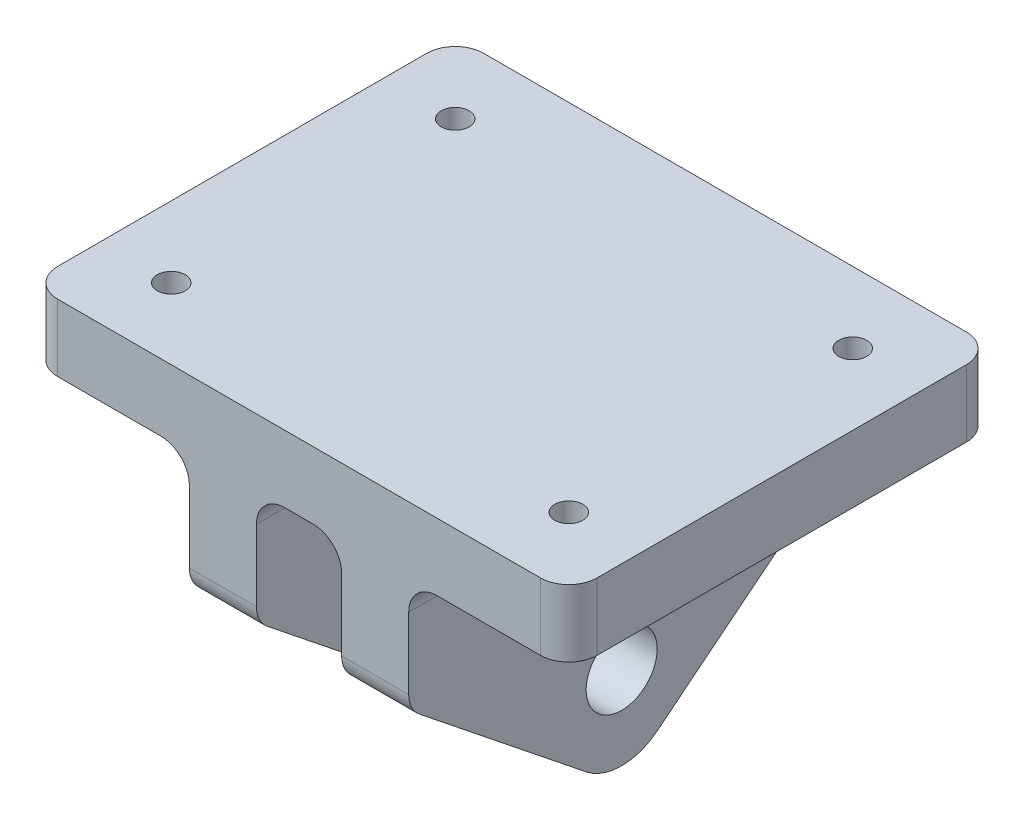
ISO-10303-21;
HEADER;
FILE_DESCRIPTION(('STEP AP214'),'2;1');
FILE_NAME('part.step','',(''),(''),'','','');
FILE_SCHEMA(('AUTOMOTIVE_DESIGN { 1 0 10303 214 1 1 1 1 }'));
ENDSEC;
DATA;
#1=APPLICATION_CONTEXT('core data for automotive mechanical design processes');
#2=APPLICATION_PROTOCOL_DEFINITION('international standard','automotive_design',2000,#1);
#3=PRODUCT_CONTEXT('',#1,'mechanical');
#4=PRODUCT('Part','Part','',(#3));
#5=PRODUCT_RELATED_PRODUCT_CATEGORY('part','',(#4));
#6=PRODUCT_DEFINITION_FORMATION('','',#4);
#7=PRODUCT_DEFINITION_CONTEXT('part definition',#1,'design');
#8=PRODUCT_DEFINITION('design','',#6,#7);
#9=PRODUCT_DEFINITION_SHAPE('','',#8);
#10=(LENGTH_UNIT() NAMED_UNIT(*) SI_UNIT(.MILLI.,.METRE.));
#11=(NAMED_UNIT(*) PLANE_ANGLE_UNIT() SI_UNIT($,.RADIAN.));
#12=(NAMED_UNIT(*) SI_UNIT($,.STERADIAN.) SOLID_ANGLE_UNIT());
#13=UNCERTAINTY_MEASURE_WITH_UNIT(LENGTH_MEASURE(1.E-05),#10,'distance_accuracy_value','');
#14=(GEOMETRIC_REPRESENTATION_CONTEXT(3) GLOBAL_UNCERTAINTY_ASSIGNED_CONTEXT((#13)) GLOBAL_UNIT_ASSIGNED_CONTEXT((#10,
#11,#12)) REPRESENTATION_CONTEXT('',''));
#15=CARTESIAN_POINT('',(0.,0.,0.));
#16=DIRECTION('',(0.,0.,1.));
#17=DIRECTION('',(1.,0.,0.));
#18=AXIS2_PLACEMENT_3D('',#15,#16,#17);
#19=CARTESIAN_POINT('',(0.,0.,0.));
#20=DIRECTION('',(0.,-1.,0.));
#21=DIRECTION('',(0.,0.,-1.));
#22=AXIS2_PLACEMENT_3D('',#19,#20,#21);
#23=PLANE('',#22);
#24=DIRECTION('',(1.,0.,0.));
#25=VECTOR('',#24,1.);
#26=CARTESIAN_POINT('',(0.,0.,19.05));
#27=LINE('',#26,#25);
#28=CARTESIAN_POINT('',(-1.27,0.,19.05));
#29=VERTEX_POINT('',#28);
#30=CARTESIAN_POINT('',(1.27,0.,19.05));
#31=VERTEX_POINT('',#30);
#32=EDGE_CURVE('E407',#29,#31,#27,.T.);
#33=ORIENTED_EDGE('',*,*,#32,.F.);
#34=DIRECTION('',(0.,0.,-1.));
#35=VECTOR('',#34,1.);
#36=CARTESIAN_POINT('',(-1.27,0.,0.));
#37=LINE('',#36,#35);
#38=CARTESIAN_POINT('',(-1.27,0.,-19.05));
#39=VERTEX_POINT('',#38);
#40=EDGE_CURVE('E333',#29,#39,#37,.T.);
#41=ORIENTED_EDGE('',*,*,#40,.T.);
#42=DIRECTION('',(1.,0.,0.));
#43=VECTOR('',#42,1.);
#44=CARTESIAN_POINT('',(0.,0.,-19.05));
#45=LINE('',#44,#43);
#46=CARTESIAN_POINT('',(1.27,0.,-19.05));
#47=VERTEX_POINT('',#46);
#48=EDGE_CURVE('E474',#39,#47,#45,.T.);
#49=ORIENTED_EDGE('',*,*,#48,.T.);
#50=DIRECTION('',(0.,0.,-1.));
#51=VECTOR('',#50,1.);
#52=CARTESIAN_POINT('',(1.27,0.,0.));
#53=LINE('',#52,#51);
#54=EDGE_CURVE('E331',#47,#31,#53,.F.);
#55=ORIENTED_EDGE('',*,*,#54,.T.);
#56=EDGE_LOOP('',(#33,#41,#49,#55));
#57=FACE_BOUND('',#56,.T.);
#58=ADVANCED_FACE('F46',(#57),#23,.T.);
#59=CARTESIAN_POINT('',(9.81,-15.4878048780488,-12.390243902439));
#60=DIRECTION('',(0.,0.78086880944303,0.624695047554424));
#61=DIRECTION('',(0.,-0.624695047554424,0.78086880944303));
#62=AXIS2_PLACEMENT_3D('',#59,#60,#61);
#63=PLANE('',#62);
#64=DIRECTION('',(0.,0.624695047554424,-0.78086880944303));
#65=VECTOR('',#64,1.);
#66=CARTESIAN_POINT('',(9.81,-15.4878048780488,-12.390243902439));
#67=LINE('',#66,#65);
#68=CARTESIAN_POINT('',(9.81,-22.8612393267388,-3.17345084157647));
#69=VERTEX_POINT('',#68);
#70=CARTESIAN_POINT('',(9.81,-10.9226196633694,-18.0967254207882));
#71=VERTEX_POINT('',#70);
#72=EDGE_CURVE('E394',#69,#71,#67,.T.);
#73=ORIENTED_EDGE('',*,*,#72,.F.);
#74=DIRECTION('',(-1.,0.,0.));
#75=VECTOR('',#74,1.);
#76=CARTESIAN_POINT('',(9.81,-22.8612393267388,-3.17345084157647));
#77=LINE('',#76,#75);
#78=CARTESIAN_POINT('',(3.81,-22.8612393267388,-3.17345084157647));
#79=VERTEX_POINT('',#78);
#80=EDGE_CURVE('E287',#69,#79,#77,.T.);
#81=ORIENTED_EDGE('',*,*,#80,.T.);
#82=DIRECTION('',(0.,0.624695047554424,-0.78086880944303));
#83=VECTOR('',#82,1.);
#84=CARTESIAN_POINT('',(3.81,-15.4878048780488,-12.390243902439));
#85=LINE('',#84,#83);
#86=CARTESIAN_POINT('',(3.81,-10.9226196633694,-18.0967254207882));
#87=VERTEX_POINT('',#86);
#88=EDGE_CURVE('E421',#79,#87,#85,.T.);
#89=ORIENTED_EDGE('',*,*,#88,.T.);
#90=DIRECTION('',(-1.,0.,0.));
#91=VECTOR('',#90,1.);
#92=CARTESIAN_POINT('',(9.81,-10.9226196633694,-18.0967254207882));
#93=LINE('',#92,#91);
#94=EDGE_CURVE('E285',#87,#71,#93,.F.);
#95=ORIENTED_EDGE('',*,*,#94,.T.);
#96=EDGE_LOOP('',(#73,#81,#89,#95));
#97=FACE_BOUND('',#96,.T.);
#98=ADVANCED_FACE('F462',(#97),#63,.F.);
#99=CARTESIAN_POINT('',(9.81,0.,-19.05));
#100=DIRECTION('',(0.,0.,1.));
#101=DIRECTION('',(0.,-1.,0.));
#102=AXIS2_PLACEMENT_3D('',#99,#100,#101);
#103=PLANE('',#102);
#104=DIRECTION('',(0.,1.,0.));
#105=VECTOR('',#104,1.);
#106=CARTESIAN_POINT('',(-3.81,0.,-19.05));
#107=LINE('',#106,#105);
#108=CARTESIAN_POINT('',(-3.81,-8.93921288738412,-19.05));
#109=VERTEX_POINT('',#108);
#110=CARTESIAN_POINT('',(-3.81,-2.53999999999999,-19.05));
#111=VERTEX_POINT('',#110);
#112=EDGE_CURVE('E517',#109,#111,#107,.T.);
#113=ORIENTED_EDGE('',*,*,#112,.F.);
#114=DIRECTION('',(1.,0.,0.));
#115=VECTOR('',#114,1.);
#116=CARTESIAN_POINT('',(-9.81,-8.93921288738412,-19.05));
#117=LINE('',#116,#115);
#118=CARTESIAN_POINT('',(-9.81,-8.93921288738412,-19.05));
#119=VERTEX_POINT('',#118);
#120=EDGE_CURVE('E320',#109,#119,#117,.F.);
#121=ORIENTED_EDGE('',*,*,#120,.T.);
#122=DIRECTION('',(0.,1.,0.));
#123=VECTOR('',#122,1.);
#124=CARTESIAN_POINT('',(-9.81,0.,-19.05));
#125=LINE('',#124,#123);
#126=CARTESIAN_POINT('',(-9.81,-2.53999999999999,-19.05));
#127=VERTEX_POINT('',#126);
#128=EDGE_CURVE('E514',#119,#127,#125,.T.);
#129=ORIENTED_EDGE('',*,*,#128,.T.);
#130=CARTESIAN_POINT('',(-12.35,-2.53999999999999,-19.05));
#131=DIRECTION('',(0.,0.,1.));
#132=DIRECTION('',(0.,-1.,0.));
#133=AXIS2_PLACEMENT_3D('',#130,#131,#132);
#134=CIRCLE('',#133,2.54);
#135=CARTESIAN_POINT('',(-12.35,0.,-19.05));
#136=VERTEX_POINT('',#135);
#137=EDGE_CURVE('E373',#127,#136,#134,.T.);
#138=ORIENTED_EDGE('',*,*,#137,.T.);
#139=CARTESIAN_POINT('',(-21.59,0.,-19.05));
#140=VERTEX_POINT('',#139);
#141=EDGE_CURVE('E478',#140,#136,#45,.T.);
#142=ORIENTED_EDGE('',*,*,#141,.F.);
#143=DIRECTION('',(0.,1.,0.));
#144=VECTOR('',#143,1.);
#145=CARTESIAN_POINT('',(-21.59,5.999999938,-19.05));
#146=LINE('',#145,#144);
#147=CARTESIAN_POINT('',(-21.59,5.999999938,-19.05));
#148=VERTEX_POINT('',#147);
#149=EDGE_CURVE('E314',#140,#148,#146,.T.);
#150=ORIENTED_EDGE('',*,*,#149,.T.);
#151=DIRECTION('',(1.,0.,0.));
#152=VECTOR('',#151,1.);
#153=CARTESIAN_POINT('',(0.,5.999999938,-19.05));
#154=LINE('',#153,#152);
#155=CARTESIAN_POINT('',(21.59,5.999999938,-19.05));
#156=VERTEX_POINT('',#155);
#157=EDGE_CURVE('E413',#148,#156,#154,.T.);
#158=ORIENTED_EDGE('',*,*,#157,.T.);
#159=DIRECTION('',(0.,1.,0.));
#160=VECTOR('',#159,1.);
#161=CARTESIAN_POINT('',(21.59,0.,-19.05));
#162=LINE('',#161,#160);
#163=CARTESIAN_POINT('',(21.59,0.,-19.05));
#164=VERTEX_POINT('',#163);
#165=EDGE_CURVE('E312',#156,#164,#162,.F.);
#166=ORIENTED_EDGE('',*,*,#165,.T.);
#167=CARTESIAN_POINT('',(12.35,0.,-19.05));
#168=VERTEX_POINT('',#167);
#169=EDGE_CURVE('E384',#168,#164,#45,.T.);
#170=ORIENTED_EDGE('',*,*,#169,.F.);
#171=CARTESIAN_POINT('',(12.35,-2.53999999999999,-19.05));
#172=DIRECTION('',(0.,0.,1.));
#173=DIRECTION('',(0.,-1.,0.));
#174=AXIS2_PLACEMENT_3D('',#171,#172,#173);
#175=CIRCLE('',#174,2.54);
#176=CARTESIAN_POINT('',(9.81,-2.53999999999999,-19.05));
#177=VERTEX_POINT('',#176);
#178=EDGE_CURVE('E54',#168,#177,#175,.T.);
#179=ORIENTED_EDGE('',*,*,#178,.T.);
#180=DIRECTION('',(0.,1.,0.));
#181=VECTOR('',#180,1.);
#182=CARTESIAN_POINT('',(9.81,0.,-19.05));
#183=LINE('',#182,#181);
#184=CARTESIAN_POINT('',(9.81,-8.93921288738411,-19.05));
#185=VERTEX_POINT('',#184);
#186=EDGE_CURVE('E382',#185,#177,#183,.T.);
#187=ORIENTED_EDGE('',*,*,#186,.F.);
#188=DIRECTION('',(-1.,0.,0.));
#189=VECTOR('',#188,1.);
#190=CARTESIAN_POINT('',(9.81,-8.93921288738411,-19.05));
#191=LINE('',#190,#189);
#192=CARTESIAN_POINT('',(3.81,-8.93921288738411,-19.05));
#193=VERTEX_POINT('',#192);
#194=EDGE_CURVE('E317',#185,#193,#191,.T.);
#195=ORIENTED_EDGE('',*,*,#194,.T.);
#196=DIRECTION('',(0.,1.,0.));
#197=VECTOR('',#196,1.);
#198=CARTESIAN_POINT('',(3.81,0.,-19.05));
#199=LINE('',#198,#197);
#200=CARTESIAN_POINT('',(3.81,-2.53999999999999,-19.05));
#201=VERTEX_POINT('',#200);
#202=EDGE_CURVE('E426',#193,#201,#199,.T.);
#203=ORIENTED_EDGE('',*,*,#202,.T.);
#204=CARTESIAN_POINT('',(1.27,-2.53999999999999,-19.05));
#205=DIRECTION('',(0.,0.,1.));
#206=DIRECTION('',(0.,-1.,0.));
#207=AXIS2_PLACEMENT_3D('',#204,#205,#206);
#208=CIRCLE('',#207,2.54);
#209=EDGE_CURVE('E369',#201,#47,#208,.T.);
#210=ORIENTED_EDGE('',*,*,#209,.T.);
#211=ORIENTED_EDGE('',*,*,#48,.F.);
#212=CARTESIAN_POINT('',(-1.27,-2.53999999999999,-19.05));
#213=DIRECTION('',(0.,0.,1.));
#214=DIRECTION('',(0.,-1.,0.));
#215=AXIS2_PLACEMENT_3D('',#212,#213,#214);
#216=CIRCLE('',#215,2.54);
#217=EDGE_CURVE('E365',#39,#111,#216,.T.);
#218=ORIENTED_EDGE('',*,*,#217,.T.);
#219=EDGE_LOOP('',(#113,#121,#129,#138,#142,#150,#158,#166,#170,#179,#187,#195,#203,#210,#211,#218));
#220=FACE_BOUND('',#219,.T.);
#221=ADVANCED_FACE('F381',(#220),#103,.F.);
#222=CARTESIAN_POINT('',(9.81,0.,19.05));
#223=DIRECTION('',(0.,0.,-1.));
#224=DIRECTION('',(0.,1.,0.));
#225=AXIS2_PLACEMENT_3D('',#222,#223,#224);
#226=PLANE('',#225);
#227=DIRECTION('',(0.,-1.,0.));
#228=VECTOR('',#227,1.);
#229=CARTESIAN_POINT('',(-9.81,0.,19.05));
#230=LINE('',#229,#228);
#231=CARTESIAN_POINT('',(-9.81,-2.54,19.05));
#232=VERTEX_POINT('',#231);
#233=CARTESIAN_POINT('',(-9.81,-8.93921288738411,19.05));
#234=VERTEX_POINT('',#233);
#235=EDGE_CURVE('E529',#232,#234,#230,.T.);
#236=ORIENTED_EDGE('',*,*,#235,.T.);
#237=DIRECTION('',(1.,0.,0.));
#238=VECTOR('',#237,1.);
#239=CARTESIAN_POINT('',(-3.81,-8.93921288738411,19.05));
#240=LINE('',#239,#238);
#241=CARTESIAN_POINT('',(-3.81,-8.93921288738411,19.05));
#242=VERTEX_POINT('',#241);
#243=EDGE_CURVE('E329',#234,#242,#240,.T.);
#244=ORIENTED_EDGE('',*,*,#243,.T.);
#245=DIRECTION('',(0.,-1.,0.));
#246=VECTOR('',#245,1.);
#247=CARTESIAN_POINT('',(-3.81,0.,19.05));
#248=LINE('',#247,#246);
#249=CARTESIAN_POINT('',(-3.81,-2.54,19.05));
#250=VERTEX_POINT('',#249);
#251=EDGE_CURVE('E237',#250,#242,#248,.T.);
#252=ORIENTED_EDGE('',*,*,#251,.F.);
#253=CARTESIAN_POINT('',(-1.27,-2.54,19.05));
#254=DIRECTION('',(0.,0.,-1.));
#255=DIRECTION('',(0.,1.,0.));
#256=AXIS2_PLACEMENT_3D('',#253,#254,#255);
#257=CIRCLE('',#256,2.54);
#258=EDGE_CURVE('E367',#250,#29,#257,.T.);
#259=ORIENTED_EDGE('',*,*,#258,.T.);
#260=ORIENTED_EDGE('',*,*,#32,.T.);
#261=CARTESIAN_POINT('',(1.27,-2.54,19.05));
#262=DIRECTION('',(0.,0.,-1.));
#263=DIRECTION('',(0.,1.,0.));
#264=AXIS2_PLACEMENT_3D('',#261,#262,#263);
#265=CIRCLE('',#264,2.54);
#266=CARTESIAN_POINT('',(3.81,-2.54,19.05));
#267=VERTEX_POINT('',#266);
#268=EDGE_CURVE('E371',#31,#267,#265,.T.);
#269=ORIENTED_EDGE('',*,*,#268,.T.);
#270=DIRECTION('',(0.,-1.,0.));
#271=VECTOR('',#270,1.);
#272=CARTESIAN_POINT('',(3.81,0.,19.05));
#273=LINE('',#272,#271);
#274=CARTESIAN_POINT('',(3.81,-8.93921288738411,19.05));
#275=VERTEX_POINT('',#274);
#276=EDGE_CURVE('E431',#267,#275,#273,.T.);
#277=ORIENTED_EDGE('',*,*,#276,.T.);
#278=DIRECTION('',(-1.,0.,0.));
#279=VECTOR('',#278,1.);
#280=CARTESIAN_POINT('',(9.81,-8.93921288738411,19.05));
#281=LINE('',#280,#279);
#282=CARTESIAN_POINT('',(9.81,-8.93921288738411,19.05));
#283=VERTEX_POINT('',#282);
#284=EDGE_CURVE('E327',#275,#283,#281,.F.);
#285=ORIENTED_EDGE('',*,*,#284,.T.);
#286=DIRECTION('',(0.,-1.,0.));
#287=VECTOR('',#286,1.);
#288=CARTESIAN_POINT('',(9.81,0.,19.05));
#289=LINE('',#288,#287);
#290=CARTESIAN_POINT('',(9.81,-2.54,19.05));
#291=VERTEX_POINT('',#290);
#292=EDGE_CURVE('E262',#291,#283,#289,.T.);
#293=ORIENTED_EDGE('',*,*,#292,.F.);
#294=CARTESIAN_POINT('',(12.35,-2.54,19.05));
#295=DIRECTION('',(0.,0.,-1.));
#296=DIRECTION('',(0.,1.,0.));
#297=AXIS2_PLACEMENT_3D('',#294,#295,#296);
#298=CIRCLE('',#297,2.54);
#299=CARTESIAN_POINT('',(12.35,0.,19.05));
#300=VERTEX_POINT('',#299);
#301=EDGE_CURVE('E12',#291,#300,#298,.T.);
#302=ORIENTED_EDGE('',*,*,#301,.T.);
#303=CARTESIAN_POINT('',(21.59,0.,19.05));
#304=VERTEX_POINT('',#303);
#305=EDGE_CURVE('E403',#300,#304,#27,.T.);
#306=ORIENTED_EDGE('',*,*,#305,.T.);
#307=DIRECTION('',(0.,1.,0.));
#308=VECTOR('',#307,1.);
#309=CARTESIAN_POINT('',(21.59,5.999999938,19.05));
#310=LINE('',#309,#308);
#311=CARTESIAN_POINT('',(21.59,5.999999938,19.05));
#312=VERTEX_POINT('',#311);
#313=EDGE_CURVE('E322',#304,#312,#310,.T.);
#314=ORIENTED_EDGE('',*,*,#313,.T.);
#315=DIRECTION('',(1.,0.,0.));
#316=VECTOR('',#315,1.);
#317=CARTESIAN_POINT('',(0.,5.999999938,19.05));
#318=LINE('',#317,#316);
#319=CARTESIAN_POINT('',(-21.59,5.999999938,19.05));
#320=VERTEX_POINT('',#319);
#321=EDGE_CURVE('E408',#320,#312,#318,.T.);
#322=ORIENTED_EDGE('',*,*,#321,.F.);
#323=DIRECTION('',(0.,1.,0.));
#324=VECTOR('',#323,1.);
#325=CARTESIAN_POINT('',(-21.59,0.,19.05));
#326=LINE('',#325,#324);
#327=CARTESIAN_POINT('',(-21.59,0.,19.05));
#328=VERTEX_POINT('',#327);
#329=EDGE_CURVE('E325',#320,#328,#326,.F.);
#330=ORIENTED_EDGE('',*,*,#329,.T.);
#331=CARTESIAN_POINT('',(-12.35,0.,19.05));
#332=VERTEX_POINT('',#331);
#333=EDGE_CURVE('E410',#328,#332,#27,.T.);
#334=ORIENTED_EDGE('',*,*,#333,.T.);
#335=CARTESIAN_POINT('',(-12.35,-2.54,19.05));
#336=DIRECTION('',(0.,0.,-1.));
#337=DIRECTION('',(0.,1.,0.));
#338=AXIS2_PLACEMENT_3D('',#335,#336,#337);
#339=CIRCLE('',#338,2.54);
#340=EDGE_CURVE('E375',#332,#232,#339,.T.);
#341=ORIENTED_EDGE('',*,*,#340,.T.);
#342=EDGE_LOOP('',(#236,#244,#252,#259,#260,#269,#277,#285,#293,#302,#306,#314,#322,#330,#334,#341));
#343=FACE_BOUND('',#342,.T.);
#344=ADVANCED_FACE('F402',(#343),#226,.F.);
#345=CARTESIAN_POINT('',(9.81,-16.51,0.));
#346=DIRECTION('',(-1.,0.,0.));
#347=DIRECTION('',(0.,0.,1.));
#348=AXIS2_PLACEMENT_3D('',#345,#346,#347);
#349=CYLINDRICAL_SURFACE('',#348,3.175);
#350=CARTESIAN_POINT('',(9.81,-16.51,0.));
#351=DIRECTION('',(1.,0.,0.));
#352=DIRECTION('',(0.,0.,-1.));
#353=AXIS2_PLACEMENT_3D('',#350,#351,#352);
#354=CIRCLE('',#353,3.175);
#355=CARTESIAN_POINT('',(9.81,-16.51,-3.175));
#356=VERTEX_POINT('',#355);
#357=EDGE_CURVE('E436',#356,#356,#354,.T.);
#358=ORIENTED_EDGE('',*,*,#357,.T.);
#359=EDGE_LOOP('',(#358));
#360=FACE_BOUND('',#359,.T.);
#361=CARTESIAN_POINT('',(3.81,-16.51,0.));
#362=DIRECTION('',(1.,0.,0.));
#363=DIRECTION('',(0.,0.,-1.));
#364=AXIS2_PLACEMENT_3D('',#361,#362,#363);
#365=CIRCLE('',#364,3.175);
#366=CARTESIAN_POINT('',(3.81,-16.51,-3.175));
#367=VERTEX_POINT('',#366);
#368=EDGE_CURVE('E417',#367,#367,#365,.T.);
#369=ORIENTED_EDGE('',*,*,#368,.F.);
#370=EDGE_LOOP('',(#369));
#371=FACE_BOUND('',#370,.T.);
#372=ADVANCED_FACE('F796',(#360,#371),#349,.F.);
#373=CARTESIAN_POINT('',(9.81,-15.4878048780488,12.390243902439));
#374=DIRECTION('',(0.,0.78086880944303,-0.624695047554424));
#375=DIRECTION('',(0.,0.624695047554424,0.78086880944303));
#376=AXIS2_PLACEMENT_3D('',#373,#374,#375);
#377=PLANE('',#376);
#378=DIRECTION('',(0.,-0.624695047554424,-0.78086880944303));
#379=VECTOR('',#378,1.);
#380=CARTESIAN_POINT('',(3.81,-15.4878048780488,12.390243902439));
#381=LINE('',#380,#379);
#382=CARTESIAN_POINT('',(3.81,-10.9226196633694,18.0967254207882));
#383=VERTEX_POINT('',#382);
#384=CARTESIAN_POINT('',(3.81,-22.8612393267388,3.17345084157647));
#385=VERTEX_POINT('',#384);
#386=EDGE_CURVE('E265',#383,#385,#381,.T.);
#387=ORIENTED_EDGE('',*,*,#386,.T.);
#388=DIRECTION('',(-1.,0.,0.));
#389=VECTOR('',#388,1.);
#390=CARTESIAN_POINT('',(9.81,-22.8612393267388,3.17345084157647));
#391=LINE('',#390,#389);
#392=CARTESIAN_POINT('',(9.81,-22.8612393267388,3.17345084157647));
#393=VERTEX_POINT('',#392);
#394=EDGE_CURVE('E302',#385,#393,#391,.F.);
#395=ORIENTED_EDGE('',*,*,#394,.T.);
#396=DIRECTION('',(0.,-0.624695047554424,-0.78086880944303));
#397=VECTOR('',#396,1.);
#398=CARTESIAN_POINT('',(9.81,-15.4878048780488,12.390243902439));
#399=LINE('',#398,#397);
#400=CARTESIAN_POINT('',(9.81,-10.9226196633694,18.0967254207882));
#401=VERTEX_POINT('',#400);
#402=EDGE_CURVE('E258',#401,#393,#399,.T.);
#403=ORIENTED_EDGE('',*,*,#402,.F.);
#404=DIRECTION('',(-1.,0.,0.));
#405=VECTOR('',#404,1.);
#406=CARTESIAN_POINT('',(9.81,-10.9226196633694,18.0967254207882));
#407=LINE('',#406,#405);
#408=EDGE_CURVE('E299',#401,#383,#407,.T.);
#409=ORIENTED_EDGE('',*,*,#408,.T.);
#410=EDGE_LOOP('',(#387,#395,#403,#409));
#411=FACE_BOUND('',#410,.T.);
#412=ADVANCED_FACE('F452',(#411),#377,.F.);
#413=CARTESIAN_POINT('',(9.81,0.,0.));
#414=DIRECTION('',(1.,0.,0.));
#415=DIRECTION('',(0.,0.,-1.));
#416=AXIS2_PLACEMENT_3D('',#413,#414,#415);
#417=PLANE('',#416);
#418=ORIENTED_EDGE('',*,*,#357,.F.);
#419=EDGE_LOOP('',(#418));
#420=FACE_BOUND('',#419,.T.);
#421=ORIENTED_EDGE('',*,*,#402,.T.);
#422=CARTESIAN_POINT('',(9.81,-18.8944257747682,0.));
#423=DIRECTION('',(1.,0.,0.));
#424=DIRECTION('',(0.,0.,-1.));
#425=AXIS2_PLACEMENT_3D('',#422,#423,#424);
#426=CIRCLE('',#425,5.08);
#427=EDGE_CURVE('E310',#393,#69,#426,.T.);
#428=ORIENTED_EDGE('',*,*,#427,.T.);
#429=ORIENTED_EDGE('',*,*,#72,.T.);
#430=CARTESIAN_POINT('',(9.81,-8.93921288738411,-16.51));
#431=DIRECTION('',(1.,0.,0.));
#432=DIRECTION('',(0.,0.,-1.));
#433=AXIS2_PLACEMENT_3D('',#430,#431,#432);
#434=CIRCLE('',#433,2.54);
#435=EDGE_CURVE('E308',#71,#185,#434,.T.);
#436=ORIENTED_EDGE('',*,*,#435,.T.);
#437=ORIENTED_EDGE('',*,*,#186,.T.);
#438=DIRECTION('',(0.,0.,-1.));
#439=VECTOR('',#438,1.);
#440=CARTESIAN_POINT('',(9.81,-2.54,19.05));
#441=LINE('',#440,#439);
#442=EDGE_CURVE('E304',#177,#291,#441,.F.);
#443=ORIENTED_EDGE('',*,*,#442,.T.);
#444=ORIENTED_EDGE('',*,*,#292,.T.);
#445=CARTESIAN_POINT('',(9.81,-8.93921288738411,16.51));
#446=DIRECTION('',(1.,0.,0.));
#447=DIRECTION('',(0.,0.,-1.));
#448=AXIS2_PLACEMENT_3D('',#445,#446,#447);
#449=CIRCLE('',#448,2.54);
#450=EDGE_CURVE('E306',#283,#401,#449,.T.);
#451=ORIENTED_EDGE('',*,*,#450,.T.);
#452=EDGE_LOOP('',(#421,#428,#429,#436,#437,#443,#444,#451));
#453=FACE_BOUND('',#452,.T.);
#454=ADVANCED_FACE('F389',(#420,#453),#417,.T.);
#455=CARTESIAN_POINT('',(3.81,0.,0.));
#456=DIRECTION('',(1.,0.,0.));
#457=DIRECTION('',(0.,0.,-1.));
#458=AXIS2_PLACEMENT_3D('',#455,#456,#457);
#459=PLANE('',#458);
#460=ORIENTED_EDGE('',*,*,#368,.T.);
#461=EDGE_LOOP('',(#460));
#462=FACE_BOUND('',#461,.T.);
#463=ORIENTED_EDGE('',*,*,#88,.F.);
#464=CARTESIAN_POINT('',(3.81,-18.8944257747682,0.));
#465=DIRECTION('',(1.,0.,0.));
#466=DIRECTION('',(0.,0.,-1.));
#467=AXIS2_PLACEMENT_3D('',#464,#465,#466);
#468=CIRCLE('',#467,5.08);
#469=EDGE_CURVE('E297',#79,#385,#468,.F.);
#470=ORIENTED_EDGE('',*,*,#469,.T.);
#471=ORIENTED_EDGE('',*,*,#386,.F.);
#472=CARTESIAN_POINT('',(3.81,-8.93921288738411,16.51));
#473=DIRECTION('',(1.,0.,0.));
#474=DIRECTION('',(0.,0.,-1.));
#475=AXIS2_PLACEMENT_3D('',#472,#473,#474);
#476=CIRCLE('',#475,2.54);
#477=EDGE_CURVE('E293',#383,#275,#476,.F.);
#478=ORIENTED_EDGE('',*,*,#477,.T.);
#479=ORIENTED_EDGE('',*,*,#276,.F.);
#480=DIRECTION('',(0.,0.,-1.));
#481=VECTOR('',#480,1.);
#482=CARTESIAN_POINT('',(3.81,-2.54,0.));
#483=LINE('',#482,#481);
#484=EDGE_CURVE('E290',#267,#201,#483,.T.);
#485=ORIENTED_EDGE('',*,*,#484,.T.);
#486=ORIENTED_EDGE('',*,*,#202,.F.);
#487=CARTESIAN_POINT('',(3.81,-8.93921288738411,-16.51));
#488=DIRECTION('',(1.,0.,0.));
#489=DIRECTION('',(0.,0.,-1.));
#490=AXIS2_PLACEMENT_3D('',#487,#488,#489);
#491=CIRCLE('',#490,2.54);
#492=EDGE_CURVE('E295',#193,#87,#491,.F.);
#493=ORIENTED_EDGE('',*,*,#492,.T.);
#494=EDGE_LOOP('',(#463,#470,#471,#478,#479,#485,#486,#493));
#495=FACE_BOUND('',#494,.T.);
#496=ADVANCED_FACE('F455',(#462,#495),#459,.F.);
#497=ORIENTED_EDGE('',*,*,#141,.T.);
#498=DIRECTION('',(0.,0.,-1.));
#499=VECTOR('',#498,1.);
#500=CARTESIAN_POINT('',(-12.35,0.,19.05));
#501=LINE('',#500,#499);
#502=EDGE_CURVE('E340',#136,#332,#501,.F.);
#503=ORIENTED_EDGE('',*,*,#502,.T.);
#504=ORIENTED_EDGE('',*,*,#333,.F.);
#505=CARTESIAN_POINT('',(-21.59,0.,16.51));
#506=DIRECTION('',(0.,-1.,0.));
#507=DIRECTION('',(0.,0.,-1.));
#508=AXIS2_PLACEMENT_3D('',#505,#506,#507);
#509=CIRCLE('',#508,2.54);
#510=CARTESIAN_POINT('',(-24.13,0.,16.51));
#511=VERTEX_POINT('',#510);
#512=EDGE_CURVE('E338',#328,#511,#509,.T.);
#513=ORIENTED_EDGE('',*,*,#512,.T.);
#514=DIRECTION('',(0.,0.,-1.));
#515=VECTOR('',#514,1.);
#516=CARTESIAN_POINT('',(-24.13,0.,0.));
#517=LINE('',#516,#515);
#518=CARTESIAN_POINT('',(-24.13,0.,-16.51));
#519=VERTEX_POINT('',#518);
#520=EDGE_CURVE('E501',#511,#519,#517,.T.);
#521=ORIENTED_EDGE('',*,*,#520,.T.);
#522=CARTESIAN_POINT('',(-21.59,0.,-16.51));
#523=DIRECTION('',(0.,-1.,0.));
#524=DIRECTION('',(0.,0.,-1.));
#525=AXIS2_PLACEMENT_3D('',#522,#523,#524);
#526=CIRCLE('',#525,2.54);
#527=EDGE_CURVE('E336',#519,#140,#526,.T.);
#528=ORIENTED_EDGE('',*,*,#527,.T.);
#529=EDGE_LOOP('',(#497,#503,#504,#513,#521,#528));
#530=FACE_BOUND('',#529,.T.);
#531=CARTESIAN_POINT('',(-17.78,0.,-12.7));
#532=DIRECTION('',(0.,-1.,0.));
#533=DIRECTION('',(0.,0.,-1.));
#534=AXIS2_PLACEMENT_3D('',#531,#532,#533);
#535=CIRCLE('',#534,1.25);
#536=CARTESIAN_POINT('',(-17.78,0.,-13.95));
#537=VERTEX_POINT('',#536);
#538=EDGE_CURVE('E504',#537,#537,#535,.F.);
#539=ORIENTED_EDGE('',*,*,#538,.T.);
#540=EDGE_LOOP('',(#539));
#541=FACE_BOUND('',#540,.T.);
#542=CARTESIAN_POINT('',(-17.78,0.,12.7));
#543=DIRECTION('',(0.,-1.,0.));
#544=DIRECTION('',(0.,0.,-1.));
#545=AXIS2_PLACEMENT_3D('',#542,#543,#544);
#546=CIRCLE('',#545,1.25);
#547=CARTESIAN_POINT('',(-17.78,0.,11.45));
#548=VERTEX_POINT('',#547);
#549=EDGE_CURVE('E507',#548,#548,#546,.F.);
#550=ORIENTED_EDGE('',*,*,#549,.T.);
#551=EDGE_LOOP('',(#550));
#552=FACE_BOUND('',#551,.T.);
#553=ADVANCED_FACE('F561',(#530,#541,#552),#23,.T.);
#554=CARTESIAN_POINT('',(17.78,0.,-12.7));
#555=DIRECTION('',(0.,-1.,0.));
#556=DIRECTION('',(0.,0.,-1.));
#557=AXIS2_PLACEMENT_3D('',#554,#555,#556);
#558=CIRCLE('',#557,1.25);
#559=CARTESIAN_POINT('',(17.78,0.,-13.95));
#560=VERTEX_POINT('',#559);
#561=EDGE_CURVE('E484',#560,#560,#558,.T.);
#562=ORIENTED_EDGE('',*,*,#561,.F.);
#563=EDGE_LOOP('',(#562));
#564=FACE_BOUND('',#563,.T.);
#565=CARTESIAN_POINT('',(17.78,0.,12.7));
#566=DIRECTION('',(0.,-1.,0.));
#567=DIRECTION('',(0.,0.,-1.));
#568=AXIS2_PLACEMENT_3D('',#565,#566,#567);
#569=CIRCLE('',#568,1.25);
#570=CARTESIAN_POINT('',(17.78,0.,11.45));
#571=VERTEX_POINT('',#570);
#572=EDGE_CURVE('E489',#571,#571,#569,.T.);
#573=ORIENTED_EDGE('',*,*,#572,.F.);
#574=EDGE_LOOP('',(#573));
#575=FACE_BOUND('',#574,.T.);
#576=ORIENTED_EDGE('',*,*,#305,.F.);
#577=DIRECTION('',(0.,0.,-1.));
#578=VECTOR('',#577,1.);
#579=CARTESIAN_POINT('',(12.35,0.,-19.05));
#580=LINE('',#579,#578);
#581=EDGE_CURVE('E358',#300,#168,#580,.T.);
#582=ORIENTED_EDGE('',*,*,#581,.T.);
#583=ORIENTED_EDGE('',*,*,#169,.T.);
#584=CARTESIAN_POINT('',(21.59,0.,-16.51));
#585=DIRECTION('',(0.,-1.,0.));
#586=DIRECTION('',(0.,0.,-1.));
#587=AXIS2_PLACEMENT_3D('',#584,#585,#586);
#588=CIRCLE('',#587,2.54);
#589=CARTESIAN_POINT('',(24.13,0.,-16.51));
#590=VERTEX_POINT('',#589);
#591=EDGE_CURVE('E61',#164,#590,#588,.T.);
#592=ORIENTED_EDGE('',*,*,#591,.T.);
#593=DIRECTION('',(0.,0.,-1.));
#594=VECTOR('',#593,1.);
#595=CARTESIAN_POINT('',(24.13,0.,0.));
#596=LINE('',#595,#594);
#597=CARTESIAN_POINT('',(24.13,0.,16.51));
#598=VERTEX_POINT('',#597);
#599=EDGE_CURVE('E482',#598,#590,#596,.T.);
#600=ORIENTED_EDGE('',*,*,#599,.F.);
#601=CARTESIAN_POINT('',(21.59,0.,16.51));
#602=DIRECTION('',(0.,-1.,0.));
#603=DIRECTION('',(0.,0.,-1.));
#604=AXIS2_PLACEMENT_3D('',#601,#602,#603);
#605=CIRCLE('',#604,2.54);
#606=EDGE_CURVE('E356',#598,#304,#605,.T.);
#607=ORIENTED_EDGE('',*,*,#606,.T.);
#608=EDGE_LOOP('',(#576,#582,#583,#592,#600,#607));
#609=FACE_BOUND('',#608,.T.);
#610=ADVANCED_FACE('F405',(#564,#575,#609),#23,.T.);
#611=CARTESIAN_POINT('',(0.,5.999999938,0.));
#612=DIRECTION('',(0.,-1.,0.));
#613=DIRECTION('',(0.,0.,-1.));
#614=AXIS2_PLACEMENT_3D('',#611,#612,#613);
#615=PLANE('',#614);
#616=CARTESIAN_POINT('',(-17.78,5.999999938,-12.7));
#617=DIRECTION('',(0.,-1.,0.));
#618=DIRECTION('',(0.,0.,1.));
#619=AXIS2_PLACEMENT_3D('',#616,#617,#618);
#620=CIRCLE('',#619,1.25);
#621=CARTESIAN_POINT('',(-17.78,5.999999938,-11.45));
#622=VERTEX_POINT('',#621);
#623=EDGE_CURVE('E510',#622,#622,#620,.T.);
#624=ORIENTED_EDGE('',*,*,#623,.T.);
#625=EDGE_LOOP('',(#624));
#626=FACE_BOUND('',#625,.T.);
#627=CARTESIAN_POINT('',(-17.78,5.999999938,12.7));
#628=DIRECTION('',(0.,-1.,0.));
#629=DIRECTION('',(0.,0.,-1.));
#630=AXIS2_PLACEMENT_3D('',#627,#628,#629);
#631=CIRCLE('',#630,1.25);
#632=CARTESIAN_POINT('',(-17.78,5.999999938,11.45));
#633=VERTEX_POINT('',#632);
#634=EDGE_CURVE('E511',#633,#633,#631,.T.);
#635=ORIENTED_EDGE('',*,*,#634,.T.);
#636=EDGE_LOOP('',(#635));
#637=FACE_BOUND('',#636,.T.);
#638=CARTESIAN_POINT('',(17.78,5.999999938,-12.7));
#639=DIRECTION('',(0.,1.,0.));
#640=DIRECTION('',(0.,0.,1.));
#641=AXIS2_PLACEMENT_3D('',#638,#639,#640);
#642=CIRCLE('',#641,1.25);
#643=CARTESIAN_POINT('',(17.78,5.999999938,-11.45));
#644=VERTEX_POINT('',#643);
#645=EDGE_CURVE('E492',#644,#644,#642,.T.);
#646=ORIENTED_EDGE('',*,*,#645,.F.);
#647=EDGE_LOOP('',(#646));
#648=FACE_BOUND('',#647,.T.);
#649=CARTESIAN_POINT('',(17.78,5.999999938,12.7));
#650=DIRECTION('',(0.,1.,0.));
#651=DIRECTION('',(0.,0.,-1.));
#652=AXIS2_PLACEMENT_3D('',#649,#650,#651);
#653=CIRCLE('',#652,1.25);
#654=CARTESIAN_POINT('',(17.78,5.999999938,11.45));
#655=VERTEX_POINT('',#654);
#656=EDGE_CURVE('E493',#655,#655,#653,.T.);
#657=ORIENTED_EDGE('',*,*,#656,.F.);
#658=EDGE_LOOP('',(#657));
#659=FACE_BOUND('',#658,.T.);
#660=DIRECTION('',(0.,0.,-1.));
#661=VECTOR('',#660,1.);
#662=CARTESIAN_POINT('',(-24.13,5.999999938,0.));
#663=LINE('',#662,#661);
#664=CARTESIAN_POINT('',(-24.13,5.999999938,16.51));
#665=VERTEX_POINT('',#664);
#666=CARTESIAN_POINT('',(-24.13,5.999999938,-16.51));
#667=VERTEX_POINT('',#666);
#668=EDGE_CURVE('E496',#665,#667,#663,.T.);
#669=ORIENTED_EDGE('',*,*,#668,.F.);
#670=CARTESIAN_POINT('',(-21.59,5.999999938,16.51));
#671=DIRECTION('',(0.,-1.,0.));
#672=DIRECTION('',(0.,0.,-1.));
#673=AXIS2_PLACEMENT_3D('',#670,#671,#672);
#674=CIRCLE('',#673,2.54);
#675=EDGE_CURVE('E353',#665,#320,#674,.F.);
#676=ORIENTED_EDGE('',*,*,#675,.T.);
#677=ORIENTED_EDGE('',*,*,#321,.T.);
#678=CARTESIAN_POINT('',(21.59,5.999999938,16.51));
#679=DIRECTION('',(0.,-1.,0.));
#680=DIRECTION('',(0.,0.,-1.));
#681=AXIS2_PLACEMENT_3D('',#678,#679,#680);
#682=CIRCLE('',#681,2.54);
#683=CARTESIAN_POINT('',(24.13,5.999999938,16.51));
#684=VERTEX_POINT('',#683);
#685=EDGE_CURVE('E349',#312,#684,#682,.F.);
#686=ORIENTED_EDGE('',*,*,#685,.T.);
#687=DIRECTION('',(0.,0.,-1.));
#688=VECTOR('',#687,1.);
#689=CARTESIAN_POINT('',(24.13,5.999999938,0.));
#690=LINE('',#689,#688);
#691=CARTESIAN_POINT('',(24.13,5.999999938,-16.51));
#692=VERTEX_POINT('',#691);
#693=EDGE_CURVE('E480',#684,#692,#690,.T.);
#694=ORIENTED_EDGE('',*,*,#693,.T.);
#695=CARTESIAN_POINT('',(21.59,5.999999938,-16.51));
#696=DIRECTION('',(0.,-1.,0.));
#697=DIRECTION('',(0.,0.,-1.));
#698=AXIS2_PLACEMENT_3D('',#695,#696,#697);
#699=CIRCLE('',#698,2.54);
#700=EDGE_CURVE('E347',#692,#156,#699,.F.);
#701=ORIENTED_EDGE('',*,*,#700,.T.);
#702=ORIENTED_EDGE('',*,*,#157,.F.);
#703=CARTESIAN_POINT('',(-21.59,5.999999938,-16.51));
#704=DIRECTION('',(0.,-1.,0.));
#705=DIRECTION('',(0.,0.,-1.));
#706=AXIS2_PLACEMENT_3D('',#703,#704,#705);
#707=CIRCLE('',#706,2.54);
#708=EDGE_CURVE('E351',#148,#667,#707,.F.);
#709=ORIENTED_EDGE('',*,*,#708,.T.);
#710=EDGE_LOOP('',(#669,#676,#677,#686,#694,#701,#702,#709));
#711=FACE_BOUND('',#710,.T.);
#712=ADVANCED_FACE('F571',(#626,#637,#648,#659,#711),#615,.F.);
#713=CARTESIAN_POINT('',(24.13,0.,0.));
#714=DIRECTION('',(1.,0.,0.));
#715=DIRECTION('',(0.,0.,-1.));
#716=AXIS2_PLACEMENT_3D('',#713,#714,#715);
#717=PLANE('',#716);
#718=ORIENTED_EDGE('',*,*,#693,.F.);
#719=DIRECTION('',(0.,1.,0.));
#720=VECTOR('',#719,1.);
#721=CARTESIAN_POINT('',(24.13,0.,16.51));
#722=LINE('',#721,#720);
#723=EDGE_CURVE('E68',#684,#598,#722,.F.);
#724=ORIENTED_EDGE('',*,*,#723,.T.);
#725=ORIENTED_EDGE('',*,*,#599,.T.);
#726=DIRECTION('',(0.,1.,0.));
#727=VECTOR('',#726,1.);
#728=CARTESIAN_POINT('',(24.13,5.999999938,-16.51));
#729=LINE('',#728,#727);
#730=EDGE_CURVE('E361',#590,#692,#729,.T.);
#731=ORIENTED_EDGE('',*,*,#730,.T.);
#732=EDGE_LOOP('',(#718,#724,#725,#731));
#733=FACE_BOUND('',#732,.T.);
#734=ADVANCED_FACE('F576',(#733),#717,.T.);
#735=CARTESIAN_POINT('',(17.78,-25.4,12.7));
#736=DIRECTION('',(0.,1.,0.));
#737=DIRECTION('',(0.,0.,1.));
#738=AXIS2_PLACEMENT_3D('',#735,#736,#737);
#739=CYLINDRICAL_SURFACE('',#738,1.25);
#740=ORIENTED_EDGE('',*,*,#572,.T.);
#741=EDGE_LOOP('',(#740));
#742=FACE_BOUND('',#741,.T.);
#743=ORIENTED_EDGE('',*,*,#656,.T.);
#744=EDGE_LOOP('',(#743));
#745=FACE_BOUND('',#744,.T.);
#746=ADVANCED_FACE('F582',(#742,#745),#739,.F.);
#747=CARTESIAN_POINT('',(17.78,-25.4,-12.7));
#748=DIRECTION('',(0.,1.,0.));
#749=DIRECTION('',(0.,0.,1.));
#750=AXIS2_PLACEMENT_3D('',#747,#748,#749);
#751=CYLINDRICAL_SURFACE('',#750,1.25);
#752=ORIENTED_EDGE('',*,*,#561,.T.);
#753=EDGE_LOOP('',(#752));
#754=FACE_BOUND('',#753,.T.);
#755=ORIENTED_EDGE('',*,*,#645,.T.);
#756=EDGE_LOOP('',(#755));
#757=FACE_BOUND('',#756,.T.);
#758=ADVANCED_FACE('F585',(#754,#757),#751,.F.);
#759=CARTESIAN_POINT('',(-24.13,0.,0.));
#760=DIRECTION('',(-1.,0.,0.));
#761=DIRECTION('',(0.,0.,-1.));
#762=AXIS2_PLACEMENT_3D('',#759,#760,#761);
#763=PLANE('',#762);
#764=ORIENTED_EDGE('',*,*,#520,.F.);
#765=DIRECTION('',(0.,1.,0.));
#766=VECTOR('',#765,1.);
#767=CARTESIAN_POINT('',(-24.13,5.999999938,16.51));
#768=LINE('',#767,#766);
#769=EDGE_CURVE('E344',#511,#665,#768,.T.);
#770=ORIENTED_EDGE('',*,*,#769,.T.);
#771=ORIENTED_EDGE('',*,*,#668,.T.);
#772=DIRECTION('',(0.,1.,0.));
#773=VECTOR('',#772,1.);
#774=CARTESIAN_POINT('',(-24.13,0.,-16.51));
#775=LINE('',#774,#773);
#776=EDGE_CURVE('E342',#667,#519,#775,.F.);
#777=ORIENTED_EDGE('',*,*,#776,.T.);
#778=EDGE_LOOP('',(#764,#770,#771,#777));
#779=FACE_BOUND('',#778,.T.);
#780=ADVANCED_FACE('F595',(#779),#763,.T.);
#781=CARTESIAN_POINT('',(-17.78,-25.4,12.7));
#782=DIRECTION('',(0.,1.,0.));
#783=DIRECTION('',(0.,0.,1.));
#784=AXIS2_PLACEMENT_3D('',#781,#782,#783);
#785=CYLINDRICAL_SURFACE('',#784,1.25);
#786=ORIENTED_EDGE('',*,*,#549,.F.);
#787=EDGE_LOOP('',(#786));
#788=FACE_BOUND('',#787,.T.);
#789=ORIENTED_EDGE('',*,*,#634,.F.);
#790=EDGE_LOOP('',(#789));
#791=FACE_BOUND('',#790,.T.);
#792=ADVANCED_FACE('F633',(#788,#791),#785,.F.);
#793=CARTESIAN_POINT('',(-17.78,-25.4,-12.7));
#794=DIRECTION('',(0.,1.,0.));
#795=DIRECTION('',(0.,0.,1.));
#796=AXIS2_PLACEMENT_3D('',#793,#794,#795);
#797=CYLINDRICAL_SURFACE('',#796,1.25);
#798=ORIENTED_EDGE('',*,*,#538,.F.);
#799=EDGE_LOOP('',(#798));
#800=FACE_BOUND('',#799,.T.);
#801=ORIENTED_EDGE('',*,*,#623,.F.);
#802=EDGE_LOOP('',(#801));
#803=FACE_BOUND('',#802,.T.);
#804=ADVANCED_FACE('F626',(#800,#803),#797,.F.);
#805=CARTESIAN_POINT('',(-9.81,-15.4878048780488,-12.390243902439));
#806=DIRECTION('',(0.,-0.78086880944303,-0.624695047554424));
#807=DIRECTION('',(0.,0.624695047554424,-0.78086880944303));
#808=AXIS2_PLACEMENT_3D('',#805,#806,#807);
#809=PLANE('',#808);
#810=DIRECTION('',(0.,0.624695047554424,-0.78086880944303));
#811=VECTOR('',#810,1.);
#812=CARTESIAN_POINT('',(-3.81,-15.4878048780488,-12.390243902439));
#813=LINE('',#812,#811);
#814=CARTESIAN_POINT('',(-3.81,-22.8612393267388,-3.17345084157648));
#815=VERTEX_POINT('',#814);
#816=CARTESIAN_POINT('',(-3.81,-10.9226196633694,-18.0967254207882));
#817=VERTEX_POINT('',#816);
#818=EDGE_CURVE('E253',#815,#817,#813,.T.);
#819=ORIENTED_EDGE('',*,*,#818,.F.);
#820=DIRECTION('',(1.,0.,0.));
#821=VECTOR('',#820,1.);
#822=CARTESIAN_POINT('',(-9.81,-22.8612393267388,-3.17345084157648));
#823=LINE('',#822,#821);
#824=CARTESIAN_POINT('',(-9.81,-22.8612393267388,-3.17345084157648));
#825=VERTEX_POINT('',#824);
#826=EDGE_CURVE('E275',#815,#825,#823,.F.);
#827=ORIENTED_EDGE('',*,*,#826,.T.);
#828=DIRECTION('',(0.,0.624695047554424,-0.78086880944303));
#829=VECTOR('',#828,1.);
#830=CARTESIAN_POINT('',(-9.81,-15.4878048780488,-12.390243902439));
#831=LINE('',#830,#829);
#832=CARTESIAN_POINT('',(-9.81,-10.9226196633694,-18.0967254207882));
#833=VERTEX_POINT('',#832);
#834=EDGE_CURVE('E533',#825,#833,#831,.T.);
#835=ORIENTED_EDGE('',*,*,#834,.T.);
#836=DIRECTION('',(1.,0.,0.));
#837=VECTOR('',#836,1.);
#838=CARTESIAN_POINT('',(-3.81,-10.9226196633694,-18.0967254207882));
#839=LINE('',#838,#837);
#840=EDGE_CURVE('E272',#833,#817,#839,.T.);
#841=ORIENTED_EDGE('',*,*,#840,.T.);
#842=EDGE_LOOP('',(#819,#827,#835,#841));
#843=FACE_BOUND('',#842,.T.);
#844=ADVANCED_FACE('F622',(#843),#809,.T.);
#845=CARTESIAN_POINT('',(-9.81,-15.4878048780488,12.390243902439));
#846=DIRECTION('',(0.,-0.78086880944303,0.624695047554424));
#847=DIRECTION('',(0.,-0.624695047554424,-0.78086880944303));
#848=AXIS2_PLACEMENT_3D('',#845,#846,#847);
#849=PLANE('',#848);
#850=DIRECTION('',(0.,-0.624695047554424,-0.78086880944303));
#851=VECTOR('',#850,1.);
#852=CARTESIAN_POINT('',(-9.81,-15.4878048780488,12.390243902439));
#853=LINE('',#852,#851);
#854=CARTESIAN_POINT('',(-9.81,-10.9226196633694,18.0967254207882));
#855=VERTEX_POINT('',#854);
#856=CARTESIAN_POINT('',(-9.81,-22.8612393267388,3.17345084157647));
#857=VERTEX_POINT('',#856);
#858=EDGE_CURVE('E531',#855,#857,#853,.T.);
#859=ORIENTED_EDGE('',*,*,#858,.T.);
#860=DIRECTION('',(1.,0.,0.));
#861=VECTOR('',#860,1.);
#862=CARTESIAN_POINT('',(-9.81,-22.8612393267388,3.17345084157647));
#863=LINE('',#862,#861);
#864=CARTESIAN_POINT('',(-3.81,-22.8612393267388,3.17345084157647));
#865=VERTEX_POINT('',#864);
#866=EDGE_CURVE('E252',#857,#865,#863,.T.);
#867=ORIENTED_EDGE('',*,*,#866,.T.);
#868=DIRECTION('',(0.,-0.624695047554424,-0.78086880944303));
#869=VECTOR('',#868,1.);
#870=CARTESIAN_POINT('',(-3.81,-15.4878048780488,12.390243902439));
#871=LINE('',#870,#869);
#872=CARTESIAN_POINT('',(-3.81,-10.9226196633694,18.0967254207882));
#873=VERTEX_POINT('',#872);
#874=EDGE_CURVE('E235',#873,#865,#871,.T.);
#875=ORIENTED_EDGE('',*,*,#874,.F.);
#876=DIRECTION('',(1.,0.,0.));
#877=VECTOR('',#876,1.);
#878=CARTESIAN_POINT('',(-9.80999999999999,-10.9226196633694,18.0967254207882));
#879=LINE('',#878,#877);
#880=EDGE_CURVE('E249',#873,#855,#879,.F.);
#881=ORIENTED_EDGE('',*,*,#880,.T.);
#882=EDGE_LOOP('',(#859,#867,#875,#881));
#883=FACE_BOUND('',#882,.T.);
#884=ADVANCED_FACE('F248',(#883),#849,.T.);
#885=CARTESIAN_POINT('',(-9.81,-16.51,0.));
#886=DIRECTION('',(1.,0.,0.));
#887=DIRECTION('',(0.,0.,-1.));
#888=AXIS2_PLACEMENT_3D('',#885,#886,#887);
#889=CYLINDRICAL_SURFACE('',#888,3.175);
#890=CARTESIAN_POINT('',(-9.81,-16.51,0.));
#891=DIRECTION('',(1.,0.,0.));
#892=DIRECTION('',(0.,0.,-1.));
#893=AXIS2_PLACEMENT_3D('',#890,#891,#892);
#894=CIRCLE('',#893,3.175);
#895=CARTESIAN_POINT('',(-9.81,-16.51,-3.175));
#896=VERTEX_POINT('',#895);
#897=EDGE_CURVE('E520',#896,#896,#894,.T.);
#898=ORIENTED_EDGE('',*,*,#897,.F.);
#899=EDGE_LOOP('',(#898));
#900=FACE_BOUND('',#899,.T.);
#901=CARTESIAN_POINT('',(-3.81,-16.51,0.));
#902=DIRECTION('',(1.,0.,0.));
#903=DIRECTION('',(0.,0.,-1.));
#904=AXIS2_PLACEMENT_3D('',#901,#902,#903);
#905=CIRCLE('',#904,3.175);
#906=CARTESIAN_POINT('',(-3.81,-16.51,-3.175));
#907=VERTEX_POINT('',#906);
#908=EDGE_CURVE('E524',#907,#907,#905,.T.);
#909=ORIENTED_EDGE('',*,*,#908,.T.);
#910=EDGE_LOOP('',(#909));
#911=FACE_BOUND('',#910,.T.);
#912=ADVANCED_FACE('F542',(#900,#911),#889,.F.);
#913=CARTESIAN_POINT('',(-9.81,0.,0.));
#914=DIRECTION('',(-1.,0.,0.));
#915=DIRECTION('',(0.,0.,-1.));
#916=AXIS2_PLACEMENT_3D('',#913,#914,#915);
#917=PLANE('',#916);
#918=ORIENTED_EDGE('',*,*,#897,.T.);
#919=EDGE_LOOP('',(#918));
#920=FACE_BOUND('',#919,.T.);
#921=ORIENTED_EDGE('',*,*,#834,.F.);
#922=CARTESIAN_POINT('',(-9.81,-18.8944257747682,0.));
#923=DIRECTION('',(-1.,0.,0.));
#924=DIRECTION('',(0.,0.,1.));
#925=AXIS2_PLACEMENT_3D('',#922,#923,#924);
#926=CIRCLE('',#925,5.08);
#927=EDGE_CURVE('E283',#825,#857,#926,.T.);
#928=ORIENTED_EDGE('',*,*,#927,.T.);
#929=ORIENTED_EDGE('',*,*,#858,.F.);
#930=CARTESIAN_POINT('',(-9.81,-8.93921288738411,16.51));
#931=DIRECTION('',(-1.,0.,0.));
#932=DIRECTION('',(0.,0.,1.));
#933=AXIS2_PLACEMENT_3D('',#930,#931,#932);
#934=CIRCLE('',#933,2.54);
#935=EDGE_CURVE('E257',#855,#234,#934,.T.);
#936=ORIENTED_EDGE('',*,*,#935,.T.);
#937=ORIENTED_EDGE('',*,*,#235,.F.);
#938=DIRECTION('',(0.,0.,-1.));
#939=VECTOR('',#938,1.);
#940=CARTESIAN_POINT('',(-9.81,-2.53999999999999,-19.05));
#941=LINE('',#940,#939);
#942=EDGE_CURVE('E277',#232,#127,#941,.T.);
#943=ORIENTED_EDGE('',*,*,#942,.T.);
#944=ORIENTED_EDGE('',*,*,#128,.F.);
#945=CARTESIAN_POINT('',(-9.81,-8.93921288738412,-16.51));
#946=DIRECTION('',(-1.,0.,0.));
#947=DIRECTION('',(0.,0.,1.));
#948=AXIS2_PLACEMENT_3D('',#945,#946,#947);
#949=CIRCLE('',#948,2.54);
#950=EDGE_CURVE('E281',#119,#833,#949,.T.);
#951=ORIENTED_EDGE('',*,*,#950,.T.);
#952=EDGE_LOOP('',(#921,#928,#929,#936,#937,#943,#944,#951));
#953=FACE_BOUND('',#952,.T.);
#954=ADVANCED_FACE('F539',(#920,#953),#917,.T.);
#955=CARTESIAN_POINT('',(-3.81,0.,0.));
#956=DIRECTION('',(-1.,0.,0.));
#957=DIRECTION('',(0.,0.,-1.));
#958=AXIS2_PLACEMENT_3D('',#955,#956,#957);
#959=PLANE('',#958);
#960=ORIENTED_EDGE('',*,*,#908,.F.);
#961=EDGE_LOOP('',(#960));
#962=FACE_BOUND('',#961,.T.);
#963=ORIENTED_EDGE('',*,*,#874,.T.);
#964=CARTESIAN_POINT('',(-3.81,-18.8944257747682,0.));
#965=DIRECTION('',(-1.,0.,0.));
#966=DIRECTION('',(0.,0.,1.));
#967=AXIS2_PLACEMENT_3D('',#964,#965,#966);
#968=CIRCLE('',#967,5.08);
#969=EDGE_CURVE('E270',#865,#815,#968,.F.);
#970=ORIENTED_EDGE('',*,*,#969,.T.);
#971=ORIENTED_EDGE('',*,*,#818,.T.);
#972=CARTESIAN_POINT('',(-3.81,-8.93921288738412,-16.51));
#973=DIRECTION('',(-1.,0.,0.));
#974=DIRECTION('',(0.,0.,1.));
#975=AXIS2_PLACEMENT_3D('',#972,#973,#974);
#976=CIRCLE('',#975,2.54);
#977=EDGE_CURVE('E242',#817,#109,#976,.F.);
#978=ORIENTED_EDGE('',*,*,#977,.T.);
#979=ORIENTED_EDGE('',*,*,#112,.T.);
#980=DIRECTION('',(0.,0.,-1.));
#981=VECTOR('',#980,1.);
#982=CARTESIAN_POINT('',(-3.81,-2.54,0.));
#983=LINE('',#982,#981);
#984=EDGE_CURVE('E243',#111,#250,#983,.F.);
#985=ORIENTED_EDGE('',*,*,#984,.T.);
#986=ORIENTED_EDGE('',*,*,#251,.T.);
#987=CARTESIAN_POINT('',(-3.81,-8.93921288738411,16.51));
#988=DIRECTION('',(-1.,0.,0.));
#989=DIRECTION('',(0.,0.,1.));
#990=AXIS2_PLACEMENT_3D('',#987,#988,#989);
#991=CIRCLE('',#990,2.54);
#992=EDGE_CURVE('E232',#242,#873,#991,.F.);
#993=ORIENTED_EDGE('',*,*,#992,.T.);
#994=EDGE_LOOP('',(#963,#970,#971,#978,#979,#985,#986,#993));
#995=FACE_BOUND('',#994,.T.);
#996=ADVANCED_FACE('F234',(#962,#995),#959,.F.);
#997=CARTESIAN_POINT('',(-9.81,-18.8944257747682,0.));
#998=DIRECTION('',(1.,0.,0.));
#999=DIRECTION('',(0.,0.,-1.));
#1000=AXIS2_PLACEMENT_3D('',#997,#998,#999);
#1001=CYLINDRICAL_SURFACE('',#1000,5.08);
#1002=ORIENTED_EDGE('',*,*,#927,.F.);
#1003=ORIENTED_EDGE('',*,*,#826,.F.);
#1004=ORIENTED_EDGE('',*,*,#969,.F.);
#1005=ORIENTED_EDGE('',*,*,#866,.F.);
#1006=EDGE_LOOP('',(#1002,#1003,#1004,#1005));
#1007=FACE_BOUND('',#1006,.T.);
#1008=ADVANCED_FACE('F549',(#1007),#1001,.T.);
#1009=CARTESIAN_POINT('',(9.81,-18.8944257747682,0.));
#1010=DIRECTION('',(-1.,0.,0.));
#1011=DIRECTION('',(0.,0.,1.));
#1012=AXIS2_PLACEMENT_3D('',#1009,#1010,#1011);
#1013=CYLINDRICAL_SURFACE('',#1012,5.08);
#1014=ORIENTED_EDGE('',*,*,#427,.F.);
#1015=ORIENTED_EDGE('',*,*,#394,.F.);
#1016=ORIENTED_EDGE('',*,*,#469,.F.);
#1017=ORIENTED_EDGE('',*,*,#80,.F.);
#1018=EDGE_LOOP('',(#1014,#1015,#1016,#1017));
#1019=FACE_BOUND('',#1018,.T.);
#1020=ADVANCED_FACE('F459',(#1019),#1013,.T.);
#1021=CARTESIAN_POINT('',(-9.81,-8.93921288738412,-16.51));
#1022=DIRECTION('',(-1.,0.,0.));
#1023=DIRECTION('',(0.,0.,1.));
#1024=AXIS2_PLACEMENT_3D('',#1021,#1022,#1023);
#1025=CYLINDRICAL_SURFACE('',#1024,2.54);
#1026=ORIENTED_EDGE('',*,*,#950,.F.);
#1027=ORIENTED_EDGE('',*,*,#120,.F.);
#1028=ORIENTED_EDGE('',*,*,#977,.F.);
#1029=ORIENTED_EDGE('',*,*,#840,.F.);
#1030=EDGE_LOOP('',(#1026,#1027,#1028,#1029));
#1031=FACE_BOUND('',#1030,.T.);
#1032=ADVANCED_FACE('F620',(#1031),#1025,.T.);
#1033=CARTESIAN_POINT('',(9.81,-8.93921288738411,-16.51));
#1034=DIRECTION('',(-1.,0.,0.));
#1035=DIRECTION('',(0.,0.,1.));
#1036=AXIS2_PLACEMENT_3D('',#1033,#1034,#1035);
#1037=CYLINDRICAL_SURFACE('',#1036,2.54);
#1038=ORIENTED_EDGE('',*,*,#435,.F.);
#1039=ORIENTED_EDGE('',*,*,#94,.F.);
#1040=ORIENTED_EDGE('',*,*,#492,.F.);
#1041=ORIENTED_EDGE('',*,*,#194,.F.);
#1042=EDGE_LOOP('',(#1038,#1039,#1040,#1041));
#1043=FACE_BOUND('',#1042,.T.);
#1044=ADVANCED_FACE('F465',(#1043),#1037,.T.);
#1045=CARTESIAN_POINT('',(9.81,-8.93921288738411,16.51));
#1046=DIRECTION('',(-1.,0.,0.));
#1047=DIRECTION('',(0.,0.,1.));
#1048=AXIS2_PLACEMENT_3D('',#1045,#1046,#1047);
#1049=CYLINDRICAL_SURFACE('',#1048,2.54);
#1050=ORIENTED_EDGE('',*,*,#935,.F.);
#1051=ORIENTED_EDGE('',*,*,#880,.F.);
#1052=ORIENTED_EDGE('',*,*,#992,.F.);
#1053=ORIENTED_EDGE('',*,*,#243,.F.);
#1054=EDGE_LOOP('',(#1050,#1051,#1052,#1053));
#1055=FACE_BOUND('',#1054,.T.);
#1056=ADVANCED_FACE('F256',(#1055),#1049,.T.);
#1057=CARTESIAN_POINT('',(9.81,-8.93921288738411,16.51));
#1058=DIRECTION('',(-1.,0.,0.));
#1059=DIRECTION('',(0.,0.,1.));
#1060=AXIS2_PLACEMENT_3D('',#1057,#1058,#1059);
#1061=CYLINDRICAL_SURFACE('',#1060,2.54);
#1062=ORIENTED_EDGE('',*,*,#450,.F.);
#1063=ORIENTED_EDGE('',*,*,#284,.F.);
#1064=ORIENTED_EDGE('',*,*,#477,.F.);
#1065=ORIENTED_EDGE('',*,*,#408,.F.);
#1066=EDGE_LOOP('',(#1062,#1063,#1064,#1065));
#1067=FACE_BOUND('',#1066,.T.);
#1068=ADVANCED_FACE('F451',(#1067),#1061,.T.);
#1069=CARTESIAN_POINT('',(-1.27,-2.54,0.));
#1070=DIRECTION('',(0.,0.,-1.));
#1071=DIRECTION('',(0.,1.,0.));
#1072=AXIS2_PLACEMENT_3D('',#1069,#1070,#1071);
#1073=CYLINDRICAL_SURFACE('',#1072,2.54);
#1074=ORIENTED_EDGE('',*,*,#258,.F.);
#1075=ORIENTED_EDGE('',*,*,#984,.F.);
#1076=ORIENTED_EDGE('',*,*,#217,.F.);
#1077=ORIENTED_EDGE('',*,*,#40,.F.);
#1078=EDGE_LOOP('',(#1074,#1075,#1076,#1077));
#1079=FACE_BOUND('',#1078,.T.);
#1080=ADVANCED_FACE('F615',(#1079),#1073,.F.);
#1081=CARTESIAN_POINT('',(1.27,-2.54,0.));
#1082=DIRECTION('',(0.,0.,-1.));
#1083=DIRECTION('',(0.,1.,0.));
#1084=AXIS2_PLACEMENT_3D('',#1081,#1082,#1083);
#1085=CYLINDRICAL_SURFACE('',#1084,2.54);
#1086=ORIENTED_EDGE('',*,*,#268,.F.);
#1087=ORIENTED_EDGE('',*,*,#54,.F.);
#1088=ORIENTED_EDGE('',*,*,#209,.F.);
#1089=ORIENTED_EDGE('',*,*,#484,.F.);
#1090=EDGE_LOOP('',(#1086,#1087,#1088,#1089));
#1091=FACE_BOUND('',#1090,.T.);
#1092=ADVANCED_FACE('F470',(#1091),#1085,.F.);
#1093=CARTESIAN_POINT('',(-12.35,-2.54,0.));
#1094=DIRECTION('',(0.,0.,1.));
#1095=DIRECTION('',(0.,-1.,0.));
#1096=AXIS2_PLACEMENT_3D('',#1093,#1094,#1095);
#1097=CYLINDRICAL_SURFACE('',#1096,2.54);
#1098=ORIENTED_EDGE('',*,*,#340,.F.);
#1099=ORIENTED_EDGE('',*,*,#502,.F.);
#1100=ORIENTED_EDGE('',*,*,#137,.F.);
#1101=ORIENTED_EDGE('',*,*,#942,.F.);
#1102=EDGE_LOOP('',(#1098,#1099,#1100,#1101));
#1103=FACE_BOUND('',#1102,.T.);
#1104=ADVANCED_FACE('F608',(#1103),#1097,.F.);
#1105=CARTESIAN_POINT('',(-21.59,0.,16.51));
#1106=DIRECTION('',(0.,-1.,0.));
#1107=DIRECTION('',(0.,0.,-1.));
#1108=AXIS2_PLACEMENT_3D('',#1105,#1106,#1107);
#1109=CYLINDRICAL_SURFACE('',#1108,2.54);
#1110=ORIENTED_EDGE('',*,*,#512,.F.);
#1111=ORIENTED_EDGE('',*,*,#329,.F.);
#1112=ORIENTED_EDGE('',*,*,#675,.F.);
#1113=ORIENTED_EDGE('',*,*,#769,.F.);
#1114=EDGE_LOOP('',(#1110,#1111,#1112,#1113));
#1115=FACE_BOUND('',#1114,.T.);
#1116=ADVANCED_FACE('F653',(#1115),#1109,.T.);
#1117=CARTESIAN_POINT('',(-21.59,0.,-16.51));
#1118=DIRECTION('',(0.,-1.,0.));
#1119=DIRECTION('',(0.,0.,-1.));
#1120=AXIS2_PLACEMENT_3D('',#1117,#1118,#1119);
#1121=CYLINDRICAL_SURFACE('',#1120,2.54);
#1122=ORIENTED_EDGE('',*,*,#527,.F.);
#1123=ORIENTED_EDGE('',*,*,#776,.F.);
#1124=ORIENTED_EDGE('',*,*,#708,.F.);
#1125=ORIENTED_EDGE('',*,*,#149,.F.);
#1126=EDGE_LOOP('',(#1122,#1123,#1124,#1125));
#1127=FACE_BOUND('',#1126,.T.);
#1128=ADVANCED_FACE('F599',(#1127),#1121,.T.);
#1129=CARTESIAN_POINT('',(12.35,-2.54,0.));
#1130=DIRECTION('',(0.,0.,1.));
#1131=DIRECTION('',(0.,-1.,0.));
#1132=AXIS2_PLACEMENT_3D('',#1129,#1130,#1131);
#1133=CYLINDRICAL_SURFACE('',#1132,2.54);
#1134=ORIENTED_EDGE('',*,*,#301,.F.);
#1135=ORIENTED_EDGE('',*,*,#442,.F.);
#1136=ORIENTED_EDGE('',*,*,#178,.F.);
#1137=ORIENTED_EDGE('',*,*,#581,.F.);
#1138=EDGE_LOOP('',(#1134,#1135,#1136,#1137));
#1139=FACE_BOUND('',#1138,.T.);
#1140=ADVANCED_FACE('F397',(#1139),#1133,.F.);
#1141=CARTESIAN_POINT('',(21.59,0.,16.51));
#1142=DIRECTION('',(0.,-1.,0.));
#1143=DIRECTION('',(0.,0.,-1.));
#1144=AXIS2_PLACEMENT_3D('',#1141,#1142,#1143);
#1145=CYLINDRICAL_SURFACE('',#1144,2.54);
#1146=ORIENTED_EDGE('',*,*,#606,.F.);
#1147=ORIENTED_EDGE('',*,*,#723,.F.);
#1148=ORIENTED_EDGE('',*,*,#685,.F.);
#1149=ORIENTED_EDGE('',*,*,#313,.F.);
#1150=EDGE_LOOP('',(#1146,#1147,#1148,#1149));
#1151=FACE_BOUND('',#1150,.T.);
#1152=ADVANCED_FACE('F649',(#1151),#1145,.T.);
#1153=CARTESIAN_POINT('',(21.59,0.,-16.51));
#1154=DIRECTION('',(0.,-1.,0.));
#1155=DIRECTION('',(0.,0.,-1.));
#1156=AXIS2_PLACEMENT_3D('',#1153,#1154,#1155);
#1157=CYLINDRICAL_SURFACE('',#1156,2.54);
#1158=ORIENTED_EDGE('',*,*,#591,.F.);
#1159=ORIENTED_EDGE('',*,*,#165,.F.);
#1160=ORIENTED_EDGE('',*,*,#700,.F.);
#1161=ORIENTED_EDGE('',*,*,#730,.F.);
#1162=EDGE_LOOP('',(#1158,#1159,#1160,#1161));
#1163=FACE_BOUND('',#1162,.T.);
#1164=ADVANCED_FACE('F48',(#1163),#1157,.T.);
#1165=CLOSED_SHELL('',(#58,#98,#221,#344,#372,#412,#454,#496,#553,#610,#712,#734,#746,#758,#780,
#792,#804,#844,#884,#912,#954,#996,#1008,#1020,#1032,#1044,#1056,#1068,#1080,#1092,#1104,#1116,
#1128,#1140,#1152,#1164));
#1166=MANIFOLD_SOLID_BREP('B2',#1165);
#1167=ADVANCED_BREP_SHAPE_REPRESENTATION('',(#18,#1166),#14);
#1168=SHAPE_DEFINITION_REPRESENTATION(#9,#1167);
ENDSEC;
END-ISO-10303-21;
